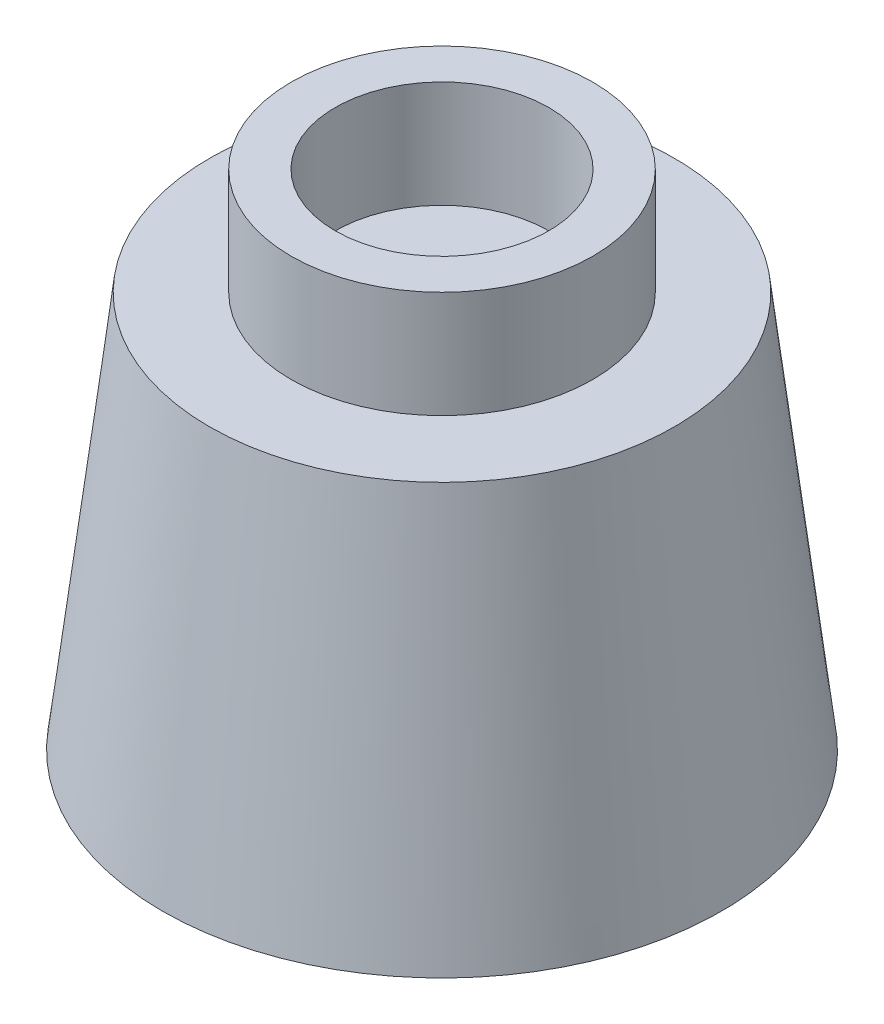
ISO-10303-21;
HEADER;
FILE_DESCRIPTION(('STEP AP214'),'2;1');
FILE_NAME('part.step','',(''),(''),'','','');
FILE_SCHEMA(('AUTOMOTIVE_DESIGN { 1 0 10303 214 1 1 1 1 }'));
ENDSEC;
DATA;
#1=APPLICATION_CONTEXT('core data for automotive mechanical design processes');
#2=APPLICATION_PROTOCOL_DEFINITION('international standard','automotive_design',2000,#1);
#3=PRODUCT_CONTEXT('',#1,'mechanical');
#4=PRODUCT('Part','Part','',(#3));
#5=PRODUCT_RELATED_PRODUCT_CATEGORY('part','',(#4));
#6=PRODUCT_DEFINITION_FORMATION('','',#4);
#7=PRODUCT_DEFINITION_CONTEXT('part definition',#1,'design');
#8=PRODUCT_DEFINITION('design','',#6,#7);
#9=PRODUCT_DEFINITION_SHAPE('','',#8);
#10=(LENGTH_UNIT() NAMED_UNIT(*) SI_UNIT(.MILLI.,.METRE.));
#11=(NAMED_UNIT(*) PLANE_ANGLE_UNIT() SI_UNIT($,.RADIAN.));
#12=(NAMED_UNIT(*) SI_UNIT($,.STERADIAN.) SOLID_ANGLE_UNIT());
#13=UNCERTAINTY_MEASURE_WITH_UNIT(LENGTH_MEASURE(1.E-05),#10,'distance_accuracy_value','');
#14=(GEOMETRIC_REPRESENTATION_CONTEXT(3) GLOBAL_UNCERTAINTY_ASSIGNED_CONTEXT((#13)) GLOBAL_UNIT_ASSIGNED_CONTEXT((#10,
#11,#12)) REPRESENTATION_CONTEXT('',''));
#15=CARTESIAN_POINT('',(0.,0.,0.));
#16=DIRECTION('',(0.,0.,1.));
#17=DIRECTION('',(1.,0.,0.));
#18=AXIS2_PLACEMENT_3D('',#15,#16,#17);
#19=CARTESIAN_POINT('',(0.,6.3,0.));
#20=DIRECTION('',(0.,1.,0.));
#21=DIRECTION('',(0.,0.,1.));
#22=AXIS2_PLACEMENT_3D('',#19,#20,#21);
#23=PLANE('',#22);
#24=CARTESIAN_POINT('',(0.,6.3,0.));
#25=DIRECTION('',(0.,1.,0.));
#26=DIRECTION('',(0.,0.,1.));
#27=AXIS2_PLACEMENT_3D('',#24,#25,#26);
#28=CIRCLE('',#27,2.4);
#29=CARTESIAN_POINT('',(0.,6.3,2.4));
#30=VERTEX_POINT('',#29);
#31=EDGE_CURVE('E120',#30,#30,#28,.T.);
#32=ORIENTED_EDGE('',*,*,#31,.F.);
#33=EDGE_LOOP('',(#32));
#34=FACE_BOUND('',#33,.T.);
#35=CARTESIAN_POINT('',(0.,6.3,0.));
#36=DIRECTION('',(0.,1.,0.));
#37=DIRECTION('',(0.,0.,1.));
#38=AXIS2_PLACEMENT_3D('',#35,#36,#37);
#39=CIRCLE('',#38,3.7);
#40=CARTESIAN_POINT('',(0.,6.3,3.7));
#41=VERTEX_POINT('',#40);
#42=EDGE_CURVE('E51',#41,#41,#39,.T.);
#43=ORIENTED_EDGE('',*,*,#42,.T.);
#44=EDGE_LOOP('',(#43));
#45=FACE_BOUND('',#44,.T.);
#46=ADVANCED_FACE('F43',(#34,#45),#23,.T.);
#47=CARTESIAN_POINT('',(0.,0.,0.));
#48=DIRECTION('',(0.,1.,0.));
#49=DIRECTION('',(0.,0.,1.));
#50=AXIS2_PLACEMENT_3D('',#47,#48,#49);
#51=PLANE('',#50);
#52=CARTESIAN_POINT('',(0.,0.,0.));
#53=DIRECTION('',(0.,-1.,0.));
#54=DIRECTION('',(0.,0.,-1.));
#55=AXIS2_PLACEMENT_3D('',#52,#53,#54);
#56=CIRCLE('',#55,3.45022951264062);
#57=CARTESIAN_POINT('',(0.,0.,-3.45022951264062));
#58=VERTEX_POINT('',#57);
#59=EDGE_CURVE('E132',#58,#58,#56,.T.);
#60=ORIENTED_EDGE('',*,*,#59,.F.);
#61=EDGE_LOOP('',(#60));
#62=FACE_BOUND('',#61,.T.);
#63=CARTESIAN_POINT('',(0.,0.,0.));
#64=DIRECTION('',(0.,1.,0.));
#65=DIRECTION('',(0.,0.,1.));
#66=AXIS2_PLACEMENT_3D('',#63,#64,#65);
#67=CIRCLE('',#66,4.45);
#68=CARTESIAN_POINT('',(0.,0.,4.45));
#69=VERTEX_POINT('',#68);
#70=EDGE_CURVE('E56',#69,#69,#67,.T.);
#71=ORIENTED_EDGE('',*,*,#70,.F.);
#72=EDGE_LOOP('',(#71));
#73=FACE_BOUND('',#72,.T.);
#74=ADVANCED_FACE('F83',(#62,#73),#51,.F.);
#75=CARTESIAN_POINT('',(0.,6.3,0.));
#76=DIRECTION('',(0.,-1.,0.));
#77=DIRECTION('',(0.,0.,-1.));
#78=AXIS2_PLACEMENT_3D('',#75,#76,#77);
#79=CONICAL_SURFACE('',#78,3.7,0.118489959158138);
#80=ORIENTED_EDGE('',*,*,#70,.T.);
#81=EDGE_LOOP('',(#80));
#82=FACE_BOUND('',#81,.T.);
#83=ORIENTED_EDGE('',*,*,#42,.F.);
#84=EDGE_LOOP('',(#83));
#85=FACE_BOUND('',#84,.T.);
#86=ADVANCED_FACE('F92',(#82,#85),#79,.T.);
#87=CARTESIAN_POINT('',(0.,8.,0.));
#88=DIRECTION('',(0.,1.,0.));
#89=DIRECTION('',(0.,0.,1.));
#90=AXIS2_PLACEMENT_3D('',#87,#88,#89);
#91=PLANE('',#90);
#92=CARTESIAN_POINT('',(0.,8.,0.));
#93=DIRECTION('',(0.,1.,0.));
#94=DIRECTION('',(0.,0.,1.));
#95=AXIS2_PLACEMENT_3D('',#92,#93,#94);
#96=CIRCLE('',#95,2.4);
#97=CARTESIAN_POINT('',(0.,8.,2.4));
#98=VERTEX_POINT('',#97);
#99=EDGE_CURVE('E63',#98,#98,#96,.T.);
#100=ORIENTED_EDGE('',*,*,#99,.T.);
#101=EDGE_LOOP('',(#100));
#102=FACE_BOUND('',#101,.T.);
#103=CARTESIAN_POINT('',(0.,8.,0.));
#104=DIRECTION('',(0.,1.,0.));
#105=DIRECTION('',(0.,0.,1.));
#106=AXIS2_PLACEMENT_3D('',#103,#104,#105);
#107=CIRCLE('',#106,1.7);
#108=CARTESIAN_POINT('',(0.,8.,1.7));
#109=VERTEX_POINT('',#108);
#110=EDGE_CURVE('E124',#109,#109,#107,.T.);
#111=ORIENTED_EDGE('',*,*,#110,.F.);
#112=EDGE_LOOP('',(#111));
#113=FACE_BOUND('',#112,.T.);
#114=ADVANCED_FACE('F98',(#102,#113),#91,.T.);
#115=CARTESIAN_POINT('',(0.,8.,0.));
#116=DIRECTION('',(0.,-1.,0.));
#117=DIRECTION('',(0.,0.,-1.));
#118=AXIS2_PLACEMENT_3D('',#115,#116,#117);
#119=CYLINDRICAL_SURFACE('',#118,2.4);
#120=ORIENTED_EDGE('',*,*,#99,.F.);
#121=EDGE_LOOP('',(#120));
#122=FACE_BOUND('',#121,.T.);
#123=ORIENTED_EDGE('',*,*,#31,.T.);
#124=EDGE_LOOP('',(#123));
#125=FACE_BOUND('',#124,.T.);
#126=ADVANCED_FACE('F94',(#122,#125),#119,.T.);
#127=CARTESIAN_POINT('',(0.,8.,0.));
#128=DIRECTION('',(0.,-1.,0.));
#129=DIRECTION('',(0.,0.,-1.));
#130=AXIS2_PLACEMENT_3D('',#127,#128,#129);
#131=CYLINDRICAL_SURFACE('',#130,1.7);
#132=ORIENTED_EDGE('',*,*,#110,.T.);
#133=EDGE_LOOP('',(#132));
#134=FACE_BOUND('',#133,.T.);
#135=CARTESIAN_POINT('',(0.,6.3,0.));
#136=DIRECTION('',(0.,1.,0.));
#137=DIRECTION('',(0.,0.,1.));
#138=AXIS2_PLACEMENT_3D('',#135,#136,#137);
#139=CIRCLE('',#138,1.7);
#140=CARTESIAN_POINT('',(0.,6.3,1.7));
#141=VERTEX_POINT('',#140);
#142=EDGE_CURVE('E12',#141,#141,#139,.F.);
#143=ORIENTED_EDGE('',*,*,#142,.T.);
#144=EDGE_LOOP('',(#143));
#145=FACE_BOUND('',#144,.T.);
#146=ADVANCED_FACE('F168',(#134,#145),#131,.F.);
#147=ORIENTED_EDGE('',*,*,#142,.F.);
#148=EDGE_LOOP('',(#147));
#149=FACE_BOUND('',#148,.T.);
#150=ADVANCED_FACE('F161',(#149),#23,.T.);
#151=CARTESIAN_POINT('',(0.,2.4,0.));
#152=DIRECTION('',(0.,-1.,0.));
#153=DIRECTION('',(0.,0.,-1.));
#154=AXIS2_PLACEMENT_3D('',#151,#152,#153);
#155=CYLINDRICAL_SURFACE('',#154,3.45022951264062);
#156=CARTESIAN_POINT('',(0.,2.4,0.));
#157=DIRECTION('',(0.,-1.,0.));
#158=DIRECTION('',(0.,0.,-1.));
#159=AXIS2_PLACEMENT_3D('',#156,#157,#158);
#160=CIRCLE('',#159,3.45022951264062);
#161=CARTESIAN_POINT('',(0.,2.4,-3.45022951264062));
#162=VERTEX_POINT('',#161);
#163=EDGE_CURVE('E131',#162,#162,#160,.T.);
#164=ORIENTED_EDGE('',*,*,#163,.F.);
#165=EDGE_LOOP('',(#164));
#166=FACE_BOUND('',#165,.T.);
#167=ORIENTED_EDGE('',*,*,#59,.T.);
#168=EDGE_LOOP('',(#167));
#169=FACE_BOUND('',#168,.T.);
#170=ADVANCED_FACE('F155',(#166,#169),#155,.F.);
#171=CARTESIAN_POINT('',(0.,2.4,0.));
#172=DIRECTION('',(0.,-1.,0.));
#173=DIRECTION('',(0.,0.,-1.));
#174=AXIS2_PLACEMENT_3D('',#171,#172,#173);
#175=PLANE('',#174);
#176=CARTESIAN_POINT('',(0.,2.4,0.));
#177=DIRECTION('',(0.,-1.,0.));
#178=DIRECTION('',(0.,0.,-1.));
#179=AXIS2_PLACEMENT_3D('',#176,#177,#178);
#180=CIRCLE('',#179,2.45022951264062);
#181=CARTESIAN_POINT('',(0.,2.4,-2.45022951264062));
#182=VERTEX_POINT('',#181);
#183=EDGE_CURVE('E143',#182,#182,#180,.T.);
#184=ORIENTED_EDGE('',*,*,#183,.F.);
#185=EDGE_LOOP('',(#184));
#186=FACE_BOUND('',#185,.T.);
#187=ORIENTED_EDGE('',*,*,#163,.T.);
#188=EDGE_LOOP('',(#187));
#189=FACE_BOUND('',#188,.T.);
#190=ADVANCED_FACE('F151',(#186,#189),#175,.T.);
#191=CARTESIAN_POINT('',(0.,5.5,0.));
#192=DIRECTION('',(0.,1.,0.));
#193=DIRECTION('',(0.,0.,1.));
#194=AXIS2_PLACEMENT_3D('',#191,#192,#193);
#195=PLANE('',#194);
#196=CARTESIAN_POINT('',(0.,5.5,0.));
#197=DIRECTION('',(0.,1.,0.));
#198=DIRECTION('',(0.,0.,1.));
#199=AXIS2_PLACEMENT_3D('',#196,#197,#198);
#200=CIRCLE('',#199,2.45022951264062);
#201=CARTESIAN_POINT('',(0.,5.5,2.45022951264062));
#202=VERTEX_POINT('',#201);
#203=EDGE_CURVE('E136',#202,#202,#200,.F.);
#204=ORIENTED_EDGE('',*,*,#203,.T.);
#205=EDGE_LOOP('',(#204));
#206=FACE_BOUND('',#205,.T.);
#207=ADVANCED_FACE('F154',(#206),#195,.F.);
#208=CARTESIAN_POINT('',(0.,17.9302956154064,0.));
#209=DIRECTION('',(0.,-1.,0.));
#210=DIRECTION('',(0.,0.,-1.));
#211=AXIS2_PLACEMENT_3D('',#208,#209,#210);
#212=CYLINDRICAL_SURFACE('',#211,2.45022951264062);
#213=ORIENTED_EDGE('',*,*,#183,.T.);
#214=EDGE_LOOP('',(#213));
#215=FACE_BOUND('',#214,.T.);
#216=ORIENTED_EDGE('',*,*,#203,.F.);
#217=EDGE_LOOP('',(#216));
#218=FACE_BOUND('',#217,.T.);
#219=ADVANCED_FACE('F148',(#215,#218),#212,.F.);
#220=CLOSED_SHELL('',(#46,#74,#86,#114,#126,#146,#150,#170,#190,#207,#219));
#221=MANIFOLD_SOLID_BREP('B2',#220);
#222=ADVANCED_BREP_SHAPE_REPRESENTATION('',(#18,#221),#14);
#223=SHAPE_DEFINITION_REPRESENTATION(#9,#222);
ENDSEC;
END-ISO-10303-21;
